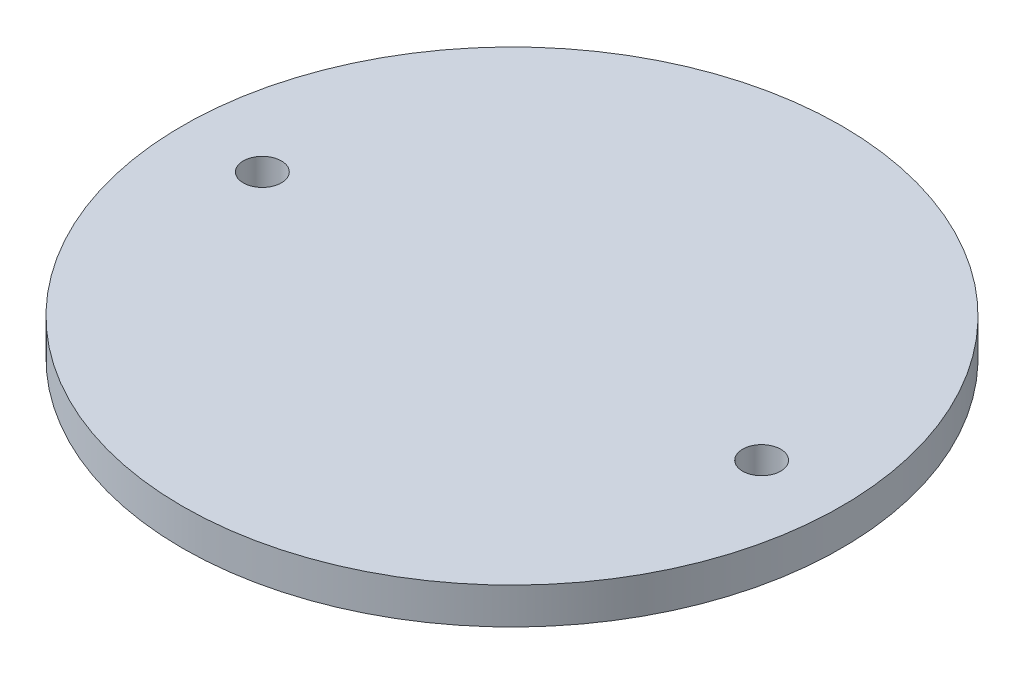
ISO-10303-21;
HEADER;
FILE_DESCRIPTION(('STEP AP214'),'2;1');
FILE_NAME('part.step','',(''),(''),'','','');
FILE_SCHEMA(('AUTOMOTIVE_DESIGN { 1 0 10303 214 1 1 1 1 }'));
ENDSEC;
DATA;
#1=APPLICATION_CONTEXT('core data for automotive mechanical design processes');
#2=APPLICATION_PROTOCOL_DEFINITION('international standard','automotive_design',2000,#1);
#3=PRODUCT_CONTEXT('',#1,'mechanical');
#4=PRODUCT('Part','Part','',(#3));
#5=PRODUCT_RELATED_PRODUCT_CATEGORY('part','',(#4));
#6=PRODUCT_DEFINITION_FORMATION('','',#4);
#7=PRODUCT_DEFINITION_CONTEXT('part definition',#1,'design');
#8=PRODUCT_DEFINITION('design','',#6,#7);
#9=PRODUCT_DEFINITION_SHAPE('','',#8);
#10=(LENGTH_UNIT() NAMED_UNIT(*) SI_UNIT(.MILLI.,.METRE.));
#11=(NAMED_UNIT(*) PLANE_ANGLE_UNIT() SI_UNIT($,.RADIAN.));
#12=(NAMED_UNIT(*) SI_UNIT($,.STERADIAN.) SOLID_ANGLE_UNIT());
#13=UNCERTAINTY_MEASURE_WITH_UNIT(LENGTH_MEASURE(1.E-05),#10,'distance_accuracy_value','');
#14=(GEOMETRIC_REPRESENTATION_CONTEXT(3) GLOBAL_UNCERTAINTY_ASSIGNED_CONTEXT((#13)) GLOBAL_UNIT_ASSIGNED_CONTEXT((#10,
#11,#12)) REPRESENTATION_CONTEXT('',''));
#15=CARTESIAN_POINT('',(0.,0.,0.));
#16=DIRECTION('',(0.,0.,1.));
#17=DIRECTION('',(1.,0.,0.));
#18=AXIS2_PLACEMENT_3D('',#15,#16,#17);
#19=CARTESIAN_POINT('',(0.,4.,0.));
#20=DIRECTION('',(0.,1.,0.));
#21=DIRECTION('',(0.,0.,1.));
#22=AXIS2_PLACEMENT_3D('',#19,#20,#21);
#23=PLANE('',#22);
#24=CARTESIAN_POINT('',(-27.5,4.,0.));
#25=DIRECTION('',(0.,1.,0.));
#26=DIRECTION('',(0.,0.,1.));
#27=AXIS2_PLACEMENT_3D('',#24,#25,#26);
#28=CIRCLE('',#27,2.1);
#29=CARTESIAN_POINT('',(-27.5,4.,2.1));
#30=VERTEX_POINT('',#29);
#31=EDGE_CURVE('E42',#30,#30,#28,.T.);
#32=ORIENTED_EDGE('',*,*,#31,.F.);
#33=EDGE_LOOP('',(#32));
#34=FACE_BOUND('',#33,.T.);
#35=CARTESIAN_POINT('',(0.,4.,0.));
#36=DIRECTION('',(0.,1.,0.));
#37=DIRECTION('',(0.,0.,1.));
#38=AXIS2_PLACEMENT_3D('',#35,#36,#37);
#39=CIRCLE('',#38,36.3);
#40=CARTESIAN_POINT('',(0.,4.,36.3));
#41=VERTEX_POINT('',#40);
#42=EDGE_CURVE('E10',#41,#41,#39,.T.);
#43=ORIENTED_EDGE('',*,*,#42,.T.);
#44=EDGE_LOOP('',(#43));
#45=FACE_BOUND('',#44,.T.);
#46=CARTESIAN_POINT('',(27.5,4.,0.));
#47=DIRECTION('',(0.,1.,0.));
#48=DIRECTION('',(0.,0.,1.));
#49=AXIS2_PLACEMENT_3D('',#46,#47,#48);
#50=CIRCLE('',#49,2.1);
#51=CARTESIAN_POINT('',(27.5,4.,2.09999999999999));
#52=VERTEX_POINT('',#51);
#53=EDGE_CURVE('E47',#52,#52,#50,.T.);
#54=ORIENTED_EDGE('',*,*,#53,.F.);
#55=EDGE_LOOP('',(#54));
#56=FACE_BOUND('',#55,.T.);
#57=ADVANCED_FACE('F31',(#34,#45,#56),#23,.T.);
#58=CARTESIAN_POINT('',(0.,0.,0.));
#59=DIRECTION('',(0.,1.,0.));
#60=DIRECTION('',(0.,0.,1.));
#61=AXIS2_PLACEMENT_3D('',#58,#59,#60);
#62=PLANE('',#61);
#63=CARTESIAN_POINT('',(0.,0.,0.));
#64=DIRECTION('',(0.,1.,0.));
#65=DIRECTION('',(0.,0.,1.));
#66=AXIS2_PLACEMENT_3D('',#63,#64,#65);
#67=CIRCLE('',#66,36.3);
#68=CARTESIAN_POINT('',(0.,0.,36.3));
#69=VERTEX_POINT('',#68);
#70=EDGE_CURVE('E35',#69,#69,#67,.T.);
#71=ORIENTED_EDGE('',*,*,#70,.F.);
#72=EDGE_LOOP('',(#71));
#73=FACE_BOUND('',#72,.T.);
#74=CARTESIAN_POINT('',(-27.5,0.,0.));
#75=DIRECTION('',(0.,1.,0.));
#76=DIRECTION('',(0.,0.,1.));
#77=AXIS2_PLACEMENT_3D('',#74,#75,#76);
#78=CIRCLE('',#77,2.1);
#79=CARTESIAN_POINT('',(-27.5,0.,2.1));
#80=VERTEX_POINT('',#79);
#81=EDGE_CURVE('E44',#80,#80,#78,.T.);
#82=ORIENTED_EDGE('',*,*,#81,.T.);
#83=EDGE_LOOP('',(#82));
#84=FACE_BOUND('',#83,.T.);
#85=CARTESIAN_POINT('',(27.5,0.,0.));
#86=DIRECTION('',(0.,1.,0.));
#87=DIRECTION('',(0.,0.,1.));
#88=AXIS2_PLACEMENT_3D('',#85,#86,#87);
#89=CIRCLE('',#88,2.1);
#90=CARTESIAN_POINT('',(27.5,0.,2.09999999999999));
#91=VERTEX_POINT('',#90);
#92=EDGE_CURVE('E50',#91,#91,#89,.T.);
#93=ORIENTED_EDGE('',*,*,#92,.T.);
#94=EDGE_LOOP('',(#93));
#95=FACE_BOUND('',#94,.T.);
#96=ADVANCED_FACE('F60',(#73,#84,#95),#62,.F.);
#97=CARTESIAN_POINT('',(0.,4.,0.));
#98=DIRECTION('',(0.,-1.,0.));
#99=DIRECTION('',(0.,0.,-1.));
#100=AXIS2_PLACEMENT_3D('',#97,#98,#99);
#101=CYLINDRICAL_SURFACE('',#100,36.3);
#102=ORIENTED_EDGE('',*,*,#42,.F.);
#103=EDGE_LOOP('',(#102));
#104=FACE_BOUND('',#103,.T.);
#105=ORIENTED_EDGE('',*,*,#70,.T.);
#106=EDGE_LOOP('',(#105));
#107=FACE_BOUND('',#106,.T.);
#108=ADVANCED_FACE('F33',(#104,#107),#101,.T.);
#109=CARTESIAN_POINT('',(-27.5,4.,0.));
#110=DIRECTION('',(0.,-1.,0.));
#111=DIRECTION('',(0.,0.,-1.));
#112=AXIS2_PLACEMENT_3D('',#109,#110,#111);
#113=CYLINDRICAL_SURFACE('',#112,2.1);
#114=ORIENTED_EDGE('',*,*,#31,.T.);
#115=EDGE_LOOP('',(#114));
#116=FACE_BOUND('',#115,.T.);
#117=ORIENTED_EDGE('',*,*,#81,.F.);
#118=EDGE_LOOP('',(#117));
#119=FACE_BOUND('',#118,.T.);
#120=ADVANCED_FACE('F69',(#116,#119),#113,.F.);
#121=CARTESIAN_POINT('',(27.5,4.,0.));
#122=DIRECTION('',(0.,-1.,0.));
#123=DIRECTION('',(0.,0.,-1.));
#124=AXIS2_PLACEMENT_3D('',#121,#122,#123);
#125=CYLINDRICAL_SURFACE('',#124,2.1);
#126=ORIENTED_EDGE('',*,*,#53,.T.);
#127=EDGE_LOOP('',(#126));
#128=FACE_BOUND('',#127,.T.);
#129=ORIENTED_EDGE('',*,*,#92,.F.);
#130=EDGE_LOOP('',(#129));
#131=FACE_BOUND('',#130,.T.);
#132=ADVANCED_FACE('F56',(#128,#131),#125,.F.);
#133=CLOSED_SHELL('',(#57,#96,#108,#120,#132));
#134=MANIFOLD_SOLID_BREP('B2',#133);
#135=ADVANCED_BREP_SHAPE_REPRESENTATION('',(#18,#134),#14);
#136=SHAPE_DEFINITION_REPRESENTATION(#9,#135);
ENDSEC;
END-ISO-10303-21;
